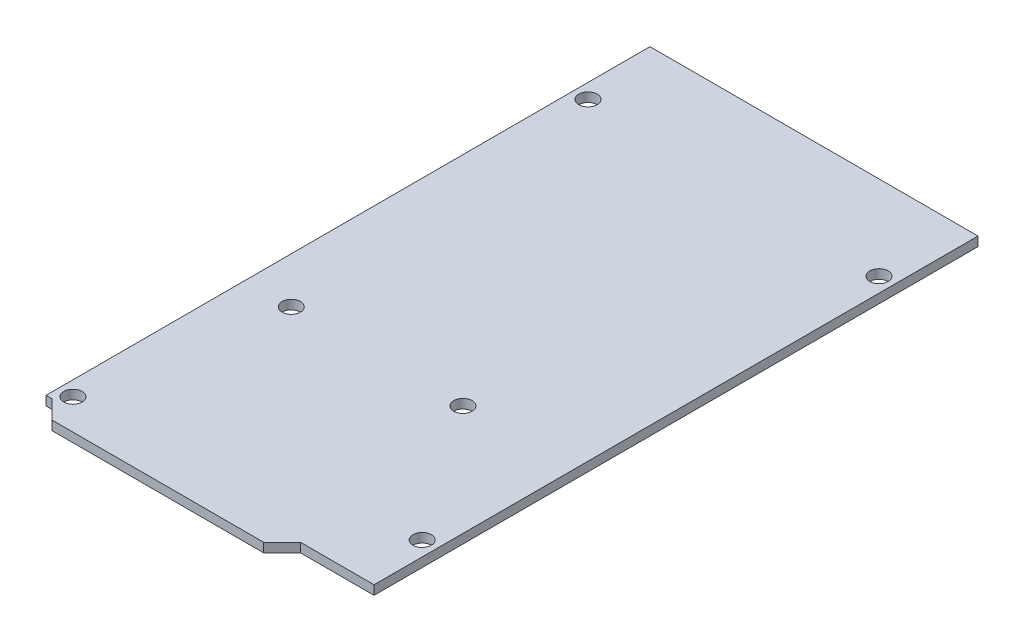
ISO-10303-21;
HEADER;
FILE_DESCRIPTION(('STEP AP214'),'2;1');
FILE_NAME('part.step','',(''),(''),'','','');
FILE_SCHEMA(('AUTOMOTIVE_DESIGN { 1 0 10303 214 1 1 1 1 }'));
ENDSEC;
DATA;
#1=APPLICATION_CONTEXT('core data for automotive mechanical design processes');
#2=APPLICATION_PROTOCOL_DEFINITION('international standard','automotive_design',2000,#1);
#3=PRODUCT_CONTEXT('',#1,'mechanical');
#4=PRODUCT('Part','Part','',(#3));
#5=PRODUCT_RELATED_PRODUCT_CATEGORY('part','',(#4));
#6=PRODUCT_DEFINITION_FORMATION('','',#4);
#7=PRODUCT_DEFINITION_CONTEXT('part definition',#1,'design');
#8=PRODUCT_DEFINITION('design','',#6,#7);
#9=PRODUCT_DEFINITION_SHAPE('','',#8);
#10=(LENGTH_UNIT() NAMED_UNIT(*) SI_UNIT(.MILLI.,.METRE.));
#11=(NAMED_UNIT(*) PLANE_ANGLE_UNIT() SI_UNIT($,.RADIAN.));
#12=(NAMED_UNIT(*) SI_UNIT($,.STERADIAN.) SOLID_ANGLE_UNIT());
#13=UNCERTAINTY_MEASURE_WITH_UNIT(LENGTH_MEASURE(1.E-05),#10,'distance_accuracy_value','');
#14=(GEOMETRIC_REPRESENTATION_CONTEXT(3) GLOBAL_UNCERTAINTY_ASSIGNED_CONTEXT((#13)) GLOBAL_UNIT_ASSIGNED_CONTEXT((#10,
#11,#12)) REPRESENTATION_CONTEXT('',''));
#15=CARTESIAN_POINT('',(0.,0.,0.));
#16=DIRECTION('',(0.,0.,1.));
#17=DIRECTION('',(1.,0.,0.));
#18=AXIS2_PLACEMENT_3D('',#15,#16,#17);
#19=CARTESIAN_POINT('',(26.75,1.5,0.));
#20=DIRECTION('',(-1.,0.,0.));
#21=DIRECTION('',(0.,0.,1.));
#22=AXIS2_PLACEMENT_3D('',#19,#20,#21);
#23=PLANE('',#22);
#24=DIRECTION('',(0.,0.,-1.));
#25=VECTOR('',#24,1.);
#26=CARTESIAN_POINT('',(26.75,0.,0.));
#27=LINE('',#26,#25);
#28=CARTESIAN_POINT('',(26.75,0.,47.75));
#29=VERTEX_POINT('',#28);
#30=CARTESIAN_POINT('',(26.75,0.,-50.75));
#31=VERTEX_POINT('',#30);
#32=EDGE_CURVE('E154',#29,#31,#27,.T.);
#33=ORIENTED_EDGE('',*,*,#32,.T.);
#34=DIRECTION('',(0.,-1.,0.));
#35=VECTOR('',#34,1.);
#36=CARTESIAN_POINT('',(26.75,1.5,-50.75));
#37=LINE('',#36,#35);
#38=CARTESIAN_POINT('',(26.75,1.5,-50.75));
#39=VERTEX_POINT('',#38);
#40=EDGE_CURVE('E11',#39,#31,#37,.T.);
#41=ORIENTED_EDGE('',*,*,#40,.F.);
#42=DIRECTION('',(0.,0.,-1.));
#43=VECTOR('',#42,1.);
#44=CARTESIAN_POINT('',(26.75,1.5,0.));
#45=LINE('',#44,#43);
#46=CARTESIAN_POINT('',(26.75,1.5,47.75));
#47=VERTEX_POINT('',#46);
#48=EDGE_CURVE('E96',#47,#39,#45,.T.);
#49=ORIENTED_EDGE('',*,*,#48,.F.);
#50=DIRECTION('',(0.,-1.,0.));
#51=VECTOR('',#50,1.);
#52=CARTESIAN_POINT('',(26.75,1.5,47.75));
#53=LINE('',#52,#51);
#54=EDGE_CURVE('E58',#47,#29,#53,.T.);
#55=ORIENTED_EDGE('',*,*,#54,.T.);
#56=EDGE_LOOP('',(#33,#41,#49,#55));
#57=FACE_BOUND('',#56,.T.);
#58=ADVANCED_FACE('F41',(#57),#23,.F.);
#59=CARTESIAN_POINT('',(0.,1.5,-50.75));
#60=DIRECTION('',(0.,0.,-1.));
#61=DIRECTION('',(-1.,0.,0.));
#62=AXIS2_PLACEMENT_3D('',#59,#60,#61);
#63=PLANE('',#62);
#64=DIRECTION('',(1.,0.,0.));
#65=VECTOR('',#64,1.);
#66=CARTESIAN_POINT('',(0.,0.,-50.75));
#67=LINE('',#66,#65);
#68=CARTESIAN_POINT('',(-26.75,0.,-50.75));
#69=VERTEX_POINT('',#68);
#70=EDGE_CURVE('E156',#69,#31,#67,.T.);
#71=ORIENTED_EDGE('',*,*,#70,.F.);
#72=DIRECTION('',(0.,-1.,0.));
#73=VECTOR('',#72,1.);
#74=CARTESIAN_POINT('',(-26.75,1.5,-50.75));
#75=LINE('',#74,#73);
#76=CARTESIAN_POINT('',(-26.75,1.5,-50.75));
#77=VERTEX_POINT('',#76);
#78=EDGE_CURVE('E50',#77,#69,#75,.T.);
#79=ORIENTED_EDGE('',*,*,#78,.F.);
#80=DIRECTION('',(1.,0.,0.));
#81=VECTOR('',#80,1.);
#82=CARTESIAN_POINT('',(0.,1.5,-50.75));
#83=LINE('',#82,#81);
#84=EDGE_CURVE('E201',#77,#39,#83,.T.);
#85=ORIENTED_EDGE('',*,*,#84,.T.);
#86=ORIENTED_EDGE('',*,*,#40,.T.);
#87=EDGE_LOOP('',(#71,#79,#85,#86));
#88=FACE_BOUND('',#87,.T.);
#89=ADVANCED_FACE('F190',(#88),#63,.T.);
#90=CARTESIAN_POINT('',(-26.75,1.5,0.));
#91=DIRECTION('',(-1.,0.,0.));
#92=DIRECTION('',(0.,0.,1.));
#93=AXIS2_PLACEMENT_3D('',#90,#91,#92);
#94=PLANE('',#93);
#95=DIRECTION('',(0.,0.,-1.));
#96=VECTOR('',#95,1.);
#97=CARTESIAN_POINT('',(-26.75,0.,0.));
#98=LINE('',#97,#96);
#99=CARTESIAN_POINT('',(-26.75,0.,47.75));
#100=VERTEX_POINT('',#99);
#101=EDGE_CURVE('E159',#100,#69,#98,.T.);
#102=ORIENTED_EDGE('',*,*,#101,.F.);
#103=DIRECTION('',(0.,-1.,0.));
#104=VECTOR('',#103,1.);
#105=CARTESIAN_POINT('',(-26.75,1.5,47.75));
#106=LINE('',#105,#104);
#107=CARTESIAN_POINT('',(-26.75,1.5,47.75));
#108=VERTEX_POINT('',#107);
#109=EDGE_CURVE('E180',#108,#100,#106,.T.);
#110=ORIENTED_EDGE('',*,*,#109,.F.);
#111=DIRECTION('',(0.,0.,-1.));
#112=VECTOR('',#111,1.);
#113=CARTESIAN_POINT('',(-26.75,1.5,0.));
#114=LINE('',#113,#112);
#115=EDGE_CURVE('E187',#108,#77,#114,.T.);
#116=ORIENTED_EDGE('',*,*,#115,.T.);
#117=ORIENTED_EDGE('',*,*,#78,.T.);
#118=EDGE_LOOP('',(#102,#110,#116,#117));
#119=FACE_BOUND('',#118,.T.);
#120=ADVANCED_FACE('F185',(#119),#94,.T.);
#121=CARTESIAN_POINT('',(0.,1.5,47.75));
#122=DIRECTION('',(0.,0.,-1.));
#123=DIRECTION('',(-1.,0.,0.));
#124=AXIS2_PLACEMENT_3D('',#121,#122,#123);
#125=PLANE('',#124);
#126=DIRECTION('',(1.,0.,0.));
#127=VECTOR('',#126,1.);
#128=CARTESIAN_POINT('',(0.,0.,47.75));
#129=LINE('',#128,#127);
#130=CARTESIAN_POINT('',(-25.75,0.,47.75));
#131=VERTEX_POINT('',#130);
#132=EDGE_CURVE('E162',#100,#131,#129,.T.);
#133=ORIENTED_EDGE('',*,*,#132,.T.);
#134=DIRECTION('',(0.,-1.,0.));
#135=VECTOR('',#134,1.);
#136=CARTESIAN_POINT('',(-25.75,1.5,47.75));
#137=LINE('',#136,#135);
#138=CARTESIAN_POINT('',(-25.75,1.5,47.75));
#139=VERTEX_POINT('',#138);
#140=EDGE_CURVE('E178',#139,#131,#137,.T.);
#141=ORIENTED_EDGE('',*,*,#140,.F.);
#142=DIRECTION('',(1.,0.,0.));
#143=VECTOR('',#142,1.);
#144=CARTESIAN_POINT('',(0.,1.5,47.75));
#145=LINE('',#144,#143);
#146=EDGE_CURVE('E199',#108,#139,#145,.T.);
#147=ORIENTED_EDGE('',*,*,#146,.F.);
#148=ORIENTED_EDGE('',*,*,#109,.T.);
#149=EDGE_LOOP('',(#133,#141,#147,#148));
#150=FACE_BOUND('',#149,.T.);
#151=ADVANCED_FACE('F197',(#150),#125,.F.);
#152=CARTESIAN_POINT('',(-36.7499999999999,1.5,36.7500000000003));
#153=DIRECTION('',(-0.707106781186544,0.,0.707106781186551));
#154=DIRECTION('',(0.707106781186551,0.,0.707106781186544));
#155=AXIS2_PLACEMENT_3D('',#152,#153,#154);
#156=PLANE('',#155);
#157=DIRECTION('',(-0.707106781186551,0.,-0.707106781186544));
#158=VECTOR('',#157,1.);
#159=CARTESIAN_POINT('',(-36.7499999999999,0.,36.7500000000003));
#160=LINE('',#159,#158);
#161=CARTESIAN_POINT('',(-22.75,0.,50.75));
#162=VERTEX_POINT('',#161);
#163=EDGE_CURVE('E165',#162,#131,#160,.T.);
#164=ORIENTED_EDGE('',*,*,#163,.F.);
#165=DIRECTION('',(0.,-1.,0.));
#166=VECTOR('',#165,1.);
#167=CARTESIAN_POINT('',(-22.75,1.5,50.75));
#168=LINE('',#167,#166);
#169=CARTESIAN_POINT('',(-22.75,1.5,50.75));
#170=VERTEX_POINT('',#169);
#171=EDGE_CURVE('E128',#170,#162,#168,.T.);
#172=ORIENTED_EDGE('',*,*,#171,.F.);
#173=DIRECTION('',(-0.707106781186551,0.,-0.707106781186544));
#174=VECTOR('',#173,1.);
#175=CARTESIAN_POINT('',(-36.7499999999999,1.5,36.7500000000003));
#176=LINE('',#175,#174);
#177=EDGE_CURVE('E118',#170,#139,#176,.T.);
#178=ORIENTED_EDGE('',*,*,#177,.T.);
#179=ORIENTED_EDGE('',*,*,#140,.T.);
#180=EDGE_LOOP('',(#164,#172,#178,#179));
#181=FACE_BOUND('',#180,.T.);
#182=ADVANCED_FACE('F206',(#181),#156,.T.);
#183=CARTESIAN_POINT('',(0.,1.5,50.75));
#184=DIRECTION('',(0.,0.,-1.));
#185=DIRECTION('',(-1.,0.,0.));
#186=AXIS2_PLACEMENT_3D('',#183,#184,#185);
#187=PLANE('',#186);
#188=DIRECTION('',(1.,0.,0.));
#189=VECTOR('',#188,1.);
#190=CARTESIAN_POINT('',(0.,0.,50.75));
#191=LINE('',#190,#189);
#192=CARTESIAN_POINT('',(11.75,0.,50.75));
#193=VERTEX_POINT('',#192);
#194=EDGE_CURVE('E125',#162,#193,#191,.T.);
#195=ORIENTED_EDGE('',*,*,#194,.T.);
#196=DIRECTION('',(0.,-1.,0.));
#197=VECTOR('',#196,1.);
#198=CARTESIAN_POINT('',(11.75,1.5,50.75));
#199=LINE('',#198,#197);
#200=CARTESIAN_POINT('',(11.75,1.5,50.75));
#201=VERTEX_POINT('',#200);
#202=EDGE_CURVE('E122',#201,#193,#199,.T.);
#203=ORIENTED_EDGE('',*,*,#202,.F.);
#204=DIRECTION('',(1.,0.,0.));
#205=VECTOR('',#204,1.);
#206=CARTESIAN_POINT('',(0.,1.5,50.75));
#207=LINE('',#206,#205);
#208=EDGE_CURVE('E112',#170,#201,#207,.T.);
#209=ORIENTED_EDGE('',*,*,#208,.F.);
#210=ORIENTED_EDGE('',*,*,#171,.T.);
#211=EDGE_LOOP('',(#195,#203,#209,#210));
#212=FACE_BOUND('',#211,.T.);
#213=ADVANCED_FACE('F123',(#212),#187,.F.);
#214=CARTESIAN_POINT('',(31.25,1.5,31.2499999999999));
#215=DIRECTION('',(-0.707106781186548,0.,-0.707106781186547));
#216=DIRECTION('',(-0.707106781186547,0.,0.707106781186548));
#217=AXIS2_PLACEMENT_3D('',#214,#215,#216);
#218=PLANE('',#217);
#219=DIRECTION('',(0.707106781186547,0.,-0.707106781186548));
#220=VECTOR('',#219,1.);
#221=CARTESIAN_POINT('',(31.25,0.,31.2499999999999));
#222=LINE('',#221,#220);
#223=CARTESIAN_POINT('',(14.75,0.,47.75));
#224=VERTEX_POINT('',#223);
#225=EDGE_CURVE('E169',#193,#224,#222,.T.);
#226=ORIENTED_EDGE('',*,*,#225,.T.);
#227=DIRECTION('',(0.,-1.,0.));
#228=VECTOR('',#227,1.);
#229=CARTESIAN_POINT('',(14.75,1.5,47.75));
#230=LINE('',#229,#228);
#231=CARTESIAN_POINT('',(14.75,1.5,47.75));
#232=VERTEX_POINT('',#231);
#233=EDGE_CURVE('E84',#232,#224,#230,.T.);
#234=ORIENTED_EDGE('',*,*,#233,.F.);
#235=DIRECTION('',(0.707106781186547,0.,-0.707106781186548));
#236=VECTOR('',#235,1.);
#237=CARTESIAN_POINT('',(31.25,1.5,31.2499999999999));
#238=LINE('',#237,#236);
#239=EDGE_CURVE('E116',#201,#232,#238,.T.);
#240=ORIENTED_EDGE('',*,*,#239,.F.);
#241=ORIENTED_EDGE('',*,*,#202,.T.);
#242=EDGE_LOOP('',(#226,#234,#240,#241));
#243=FACE_BOUND('',#242,.T.);
#244=ADVANCED_FACE('F130',(#243),#218,.F.);
#245=CARTESIAN_POINT('',(24.35,1.5,37.5));
#246=DIRECTION('',(0.,-1.,0.));
#247=DIRECTION('',(0.,0.,-1.));
#248=AXIS2_PLACEMENT_3D('',#245,#246,#247);
#249=CYLINDRICAL_SURFACE('',#248,1.5);
#250=CARTESIAN_POINT('',(24.35,1.5,37.5));
#251=DIRECTION('',(0.,1.,0.));
#252=DIRECTION('',(0.,0.,1.));
#253=AXIS2_PLACEMENT_3D('',#250,#251,#252);
#254=CIRCLE('',#253,1.5);
#255=CARTESIAN_POINT('',(24.35,1.5,39.));
#256=VERTEX_POINT('',#255);
#257=EDGE_CURVE('E434',#256,#256,#254,.T.);
#258=ORIENTED_EDGE('',*,*,#257,.T.);
#259=EDGE_LOOP('',(#258));
#260=FACE_BOUND('',#259,.T.);
#261=CARTESIAN_POINT('',(24.35,0.,37.5));
#262=DIRECTION('',(0.,1.,0.));
#263=DIRECTION('',(0.,0.,1.));
#264=AXIS2_PLACEMENT_3D('',#261,#262,#263);
#265=CIRCLE('',#264,1.5);
#266=CARTESIAN_POINT('',(24.35,0.,39.));
#267=VERTEX_POINT('',#266);
#268=EDGE_CURVE('E151',#267,#267,#265,.T.);
#269=ORIENTED_EDGE('',*,*,#268,.F.);
#270=EDGE_LOOP('',(#269));
#271=FACE_BOUND('',#270,.T.);
#272=ADVANCED_FACE('F228',(#260,#271),#249,.F.);
#273=CARTESIAN_POINT('',(24.35,1.5,-37.));
#274=DIRECTION('',(0.,-1.,0.));
#275=DIRECTION('',(0.,0.,-1.));
#276=AXIS2_PLACEMENT_3D('',#273,#274,#275);
#277=CYLINDRICAL_SURFACE('',#276,1.5);
#278=CARTESIAN_POINT('',(24.35,1.5,-37.));
#279=DIRECTION('',(0.,1.,0.));
#280=DIRECTION('',(0.,0.,1.));
#281=AXIS2_PLACEMENT_3D('',#278,#279,#280);
#282=CIRCLE('',#281,1.5);
#283=CARTESIAN_POINT('',(24.35,1.5,-35.5));
#284=VERTEX_POINT('',#283);
#285=EDGE_CURVE('E431',#284,#284,#282,.T.);
#286=ORIENTED_EDGE('',*,*,#285,.T.);
#287=EDGE_LOOP('',(#286));
#288=FACE_BOUND('',#287,.T.);
#289=CARTESIAN_POINT('',(24.35,0.,-37.));
#290=DIRECTION('',(0.,1.,0.));
#291=DIRECTION('',(0.,0.,1.));
#292=AXIS2_PLACEMENT_3D('',#289,#290,#291);
#293=CIRCLE('',#292,1.5);
#294=CARTESIAN_POINT('',(24.35,0.,-35.5));
#295=VERTEX_POINT('',#294);
#296=EDGE_CURVE('E148',#295,#295,#293,.T.);
#297=ORIENTED_EDGE('',*,*,#296,.F.);
#298=EDGE_LOOP('',(#297));
#299=FACE_BOUND('',#298,.T.);
#300=ADVANCED_FACE('F231',(#288,#299),#277,.F.);
#301=CARTESIAN_POINT('',(-24.35,1.5,45.75));
#302=DIRECTION('',(0.,-1.,0.));
#303=DIRECTION('',(0.,0.,-1.));
#304=AXIS2_PLACEMENT_3D('',#301,#302,#303);
#305=CYLINDRICAL_SURFACE('',#304,1.5);
#306=CARTESIAN_POINT('',(-24.35,1.5,45.75));
#307=DIRECTION('',(0.,1.,0.));
#308=DIRECTION('',(0.,0.,1.));
#309=AXIS2_PLACEMENT_3D('',#306,#307,#308);
#310=CIRCLE('',#309,1.5);
#311=CARTESIAN_POINT('',(-24.35,1.5,47.25));
#312=VERTEX_POINT('',#311);
#313=EDGE_CURVE('E424',#312,#312,#310,.T.);
#314=ORIENTED_EDGE('',*,*,#313,.T.);
#315=EDGE_LOOP('',(#314));
#316=FACE_BOUND('',#315,.T.);
#317=CARTESIAN_POINT('',(-24.35,0.,45.75));
#318=DIRECTION('',(0.,1.,0.));
#319=DIRECTION('',(0.,0.,1.));
#320=AXIS2_PLACEMENT_3D('',#317,#318,#319);
#321=CIRCLE('',#320,1.5);
#322=CARTESIAN_POINT('',(-24.35,0.,47.25));
#323=VERTEX_POINT('',#322);
#324=EDGE_CURVE('E145',#323,#323,#321,.T.);
#325=ORIENTED_EDGE('',*,*,#324,.F.);
#326=EDGE_LOOP('',(#325));
#327=FACE_BOUND('',#326,.T.);
#328=ADVANCED_FACE('F235',(#316,#327),#305,.F.);
#329=CARTESIAN_POINT('',(-24.35,1.5,-38.25));
#330=DIRECTION('',(0.,-1.,0.));
#331=DIRECTION('',(0.,0.,-1.));
#332=AXIS2_PLACEMENT_3D('',#329,#330,#331);
#333=CYLINDRICAL_SURFACE('',#332,1.5);
#334=CARTESIAN_POINT('',(-24.35,1.5,-38.25));
#335=DIRECTION('',(0.,1.,0.));
#336=DIRECTION('',(0.,0.,1.));
#337=AXIS2_PLACEMENT_3D('',#334,#335,#336);
#338=CIRCLE('',#337,1.5);
#339=CARTESIAN_POINT('',(-24.35,1.5,-36.75));
#340=VERTEX_POINT('',#339);
#341=EDGE_CURVE('E421',#340,#340,#338,.T.);
#342=ORIENTED_EDGE('',*,*,#341,.T.);
#343=EDGE_LOOP('',(#342));
#344=FACE_BOUND('',#343,.T.);
#345=CARTESIAN_POINT('',(-24.35,0.,-38.25));
#346=DIRECTION('',(0.,1.,0.));
#347=DIRECTION('',(0.,0.,1.));
#348=AXIS2_PLACEMENT_3D('',#345,#346,#347);
#349=CIRCLE('',#348,1.5);
#350=CARTESIAN_POINT('',(-24.35,0.,-36.75));
#351=VERTEX_POINT('',#350);
#352=EDGE_CURVE('E142',#351,#351,#349,.T.);
#353=ORIENTED_EDGE('',*,*,#352,.F.);
#354=EDGE_LOOP('',(#353));
#355=FACE_BOUND('',#354,.T.);
#356=ADVANCED_FACE('F239',(#344,#355),#333,.F.);
#357=CARTESIAN_POINT('',(-19.25,1.5,15.25));
#358=DIRECTION('',(0.,-1.,0.));
#359=DIRECTION('',(0.,0.,-1.));
#360=AXIS2_PLACEMENT_3D('',#357,#358,#359);
#361=CYLINDRICAL_SURFACE('',#360,1.5);
#362=CARTESIAN_POINT('',(-19.25,1.5,15.25));
#363=DIRECTION('',(0.,1.,0.));
#364=DIRECTION('',(0.,0.,1.));
#365=AXIS2_PLACEMENT_3D('',#362,#363,#364);
#366=CIRCLE('',#365,1.5);
#367=CARTESIAN_POINT('',(-19.25,1.5,16.75));
#368=VERTEX_POINT('',#367);
#369=EDGE_CURVE('E250',#368,#368,#366,.T.);
#370=ORIENTED_EDGE('',*,*,#369,.T.);
#371=EDGE_LOOP('',(#370));
#372=FACE_BOUND('',#371,.T.);
#373=CARTESIAN_POINT('',(-19.25,0.,15.25));
#374=DIRECTION('',(0.,1.,0.));
#375=DIRECTION('',(0.,0.,1.));
#376=AXIS2_PLACEMENT_3D('',#373,#374,#375);
#377=CIRCLE('',#376,1.5);
#378=CARTESIAN_POINT('',(-19.25,0.,16.75));
#379=VERTEX_POINT('',#378);
#380=EDGE_CURVE('E139',#379,#379,#377,.T.);
#381=ORIENTED_EDGE('',*,*,#380,.F.);
#382=EDGE_LOOP('',(#381));
#383=FACE_BOUND('',#382,.T.);
#384=ADVANCED_FACE('F216',(#372,#383),#361,.F.);
#385=CARTESIAN_POINT('',(8.75000000000001,1.5,15.25));
#386=DIRECTION('',(0.,-1.,0.));
#387=DIRECTION('',(0.,0.,-1.));
#388=AXIS2_PLACEMENT_3D('',#385,#386,#387);
#389=CYLINDRICAL_SURFACE('',#388,1.5);
#390=CARTESIAN_POINT('',(8.75000000000001,1.5,15.25));
#391=DIRECTION('',(0.,1.,0.));
#392=DIRECTION('',(0.,0.,1.));
#393=AXIS2_PLACEMENT_3D('',#390,#391,#392);
#394=CIRCLE('',#393,1.5);
#395=CARTESIAN_POINT('',(8.75000000000001,1.5,16.75));
#396=VERTEX_POINT('',#395);
#397=EDGE_CURVE('E174',#396,#396,#394,.T.);
#398=ORIENTED_EDGE('',*,*,#397,.T.);
#399=EDGE_LOOP('',(#398));
#400=FACE_BOUND('',#399,.T.);
#401=CARTESIAN_POINT('',(8.75000000000001,0.,15.25));
#402=DIRECTION('',(0.,1.,0.));
#403=DIRECTION('',(0.,0.,1.));
#404=AXIS2_PLACEMENT_3D('',#401,#402,#403);
#405=CIRCLE('',#404,1.5);
#406=CARTESIAN_POINT('',(8.75000000000001,0.,16.75));
#407=VERTEX_POINT('',#406);
#408=EDGE_CURVE('E136',#407,#407,#405,.T.);
#409=ORIENTED_EDGE('',*,*,#408,.F.);
#410=EDGE_LOOP('',(#409));
#411=FACE_BOUND('',#410,.T.);
#412=ADVANCED_FACE('F43',(#400,#411),#389,.F.);
#413=CARTESIAN_POINT('',(0.,1.5,47.75));
#414=DIRECTION('',(0.,0.,1.));
#415=DIRECTION('',(1.,0.,0.));
#416=AXIS2_PLACEMENT_3D('',#413,#414,#415);
#417=PLANE('',#416);
#418=DIRECTION('',(-1.,0.,0.));
#419=VECTOR('',#418,1.);
#420=CARTESIAN_POINT('',(0.,0.,47.75));
#421=LINE('',#420,#419);
#422=EDGE_CURVE('E171',#29,#224,#421,.T.);
#423=ORIENTED_EDGE('',*,*,#422,.F.);
#424=ORIENTED_EDGE('',*,*,#54,.F.);
#425=DIRECTION('',(-1.,0.,0.));
#426=VECTOR('',#425,1.);
#427=CARTESIAN_POINT('',(0.,1.5,47.75));
#428=LINE('',#427,#426);
#429=EDGE_CURVE('E131',#47,#232,#428,.T.);
#430=ORIENTED_EDGE('',*,*,#429,.T.);
#431=ORIENTED_EDGE('',*,*,#233,.T.);
#432=EDGE_LOOP('',(#423,#424,#430,#431));
#433=FACE_BOUND('',#432,.T.);
#434=ADVANCED_FACE('F207',(#433),#417,.T.);
#435=CARTESIAN_POINT('',(0.,1.5,0.));
#436=DIRECTION('',(0.,1.,0.));
#437=DIRECTION('',(0.,0.,1.));
#438=AXIS2_PLACEMENT_3D('',#435,#436,#437);
#439=PLANE('',#438);
#440=ORIENTED_EDGE('',*,*,#397,.F.);
#441=EDGE_LOOP('',(#440));
#442=FACE_BOUND('',#441,.T.);
#443=ORIENTED_EDGE('',*,*,#369,.F.);
#444=EDGE_LOOP('',(#443));
#445=FACE_BOUND('',#444,.T.);
#446=ORIENTED_EDGE('',*,*,#341,.F.);
#447=EDGE_LOOP('',(#446));
#448=FACE_BOUND('',#447,.T.);
#449=ORIENTED_EDGE('',*,*,#313,.F.);
#450=EDGE_LOOP('',(#449));
#451=FACE_BOUND('',#450,.T.);
#452=ORIENTED_EDGE('',*,*,#285,.F.);
#453=EDGE_LOOP('',(#452));
#454=FACE_BOUND('',#453,.T.);
#455=ORIENTED_EDGE('',*,*,#257,.F.);
#456=EDGE_LOOP('',(#455));
#457=FACE_BOUND('',#456,.T.);
#458=ORIENTED_EDGE('',*,*,#48,.T.);
#459=ORIENTED_EDGE('',*,*,#84,.F.);
#460=ORIENTED_EDGE('',*,*,#115,.F.);
#461=ORIENTED_EDGE('',*,*,#146,.T.);
#462=ORIENTED_EDGE('',*,*,#177,.F.);
#463=ORIENTED_EDGE('',*,*,#208,.T.);
#464=ORIENTED_EDGE('',*,*,#239,.T.);
#465=ORIENTED_EDGE('',*,*,#429,.F.);
#466=EDGE_LOOP('',(#458,#459,#460,#461,#462,#463,#464,#465));
#467=FACE_BOUND('',#466,.T.);
#468=ADVANCED_FACE('F114',(#442,#445,#448,#451,#454,#457,#467),#439,.T.);
#469=CARTESIAN_POINT('',(0.,0.,0.));
#470=DIRECTION('',(0.,1.,0.));
#471=DIRECTION('',(0.,0.,1.));
#472=AXIS2_PLACEMENT_3D('',#469,#470,#471);
#473=PLANE('',#472);
#474=ORIENTED_EDGE('',*,*,#408,.T.);
#475=EDGE_LOOP('',(#474));
#476=FACE_BOUND('',#475,.T.);
#477=ORIENTED_EDGE('',*,*,#380,.T.);
#478=EDGE_LOOP('',(#477));
#479=FACE_BOUND('',#478,.T.);
#480=ORIENTED_EDGE('',*,*,#352,.T.);
#481=EDGE_LOOP('',(#480));
#482=FACE_BOUND('',#481,.T.);
#483=ORIENTED_EDGE('',*,*,#324,.T.);
#484=EDGE_LOOP('',(#483));
#485=FACE_BOUND('',#484,.T.);
#486=ORIENTED_EDGE('',*,*,#296,.T.);
#487=EDGE_LOOP('',(#486));
#488=FACE_BOUND('',#487,.T.);
#489=ORIENTED_EDGE('',*,*,#268,.T.);
#490=EDGE_LOOP('',(#489));
#491=FACE_BOUND('',#490,.T.);
#492=ORIENTED_EDGE('',*,*,#32,.F.);
#493=ORIENTED_EDGE('',*,*,#422,.T.);
#494=ORIENTED_EDGE('',*,*,#225,.F.);
#495=ORIENTED_EDGE('',*,*,#194,.F.);
#496=ORIENTED_EDGE('',*,*,#163,.T.);
#497=ORIENTED_EDGE('',*,*,#132,.F.);
#498=ORIENTED_EDGE('',*,*,#101,.T.);
#499=ORIENTED_EDGE('',*,*,#70,.T.);
#500=EDGE_LOOP('',(#492,#493,#494,#495,#496,#497,#498,#499));
#501=FACE_BOUND('',#500,.T.);
#502=ADVANCED_FACE('F193',(#476,#479,#482,#485,#488,#491,#501),#473,.F.);
#503=CLOSED_SHELL('',(#58,#89,#120,#151,#182,#213,#244,#272,#300,#328,#356,#384,#412,#434,#468,#502));
#504=MANIFOLD_SOLID_BREP('B2',#503);
#505=ADVANCED_BREP_SHAPE_REPRESENTATION('',(#18,#504),#14);
#506=SHAPE_DEFINITION_REPRESENTATION(#9,#505);
ENDSEC;
END-ISO-10303-21;
